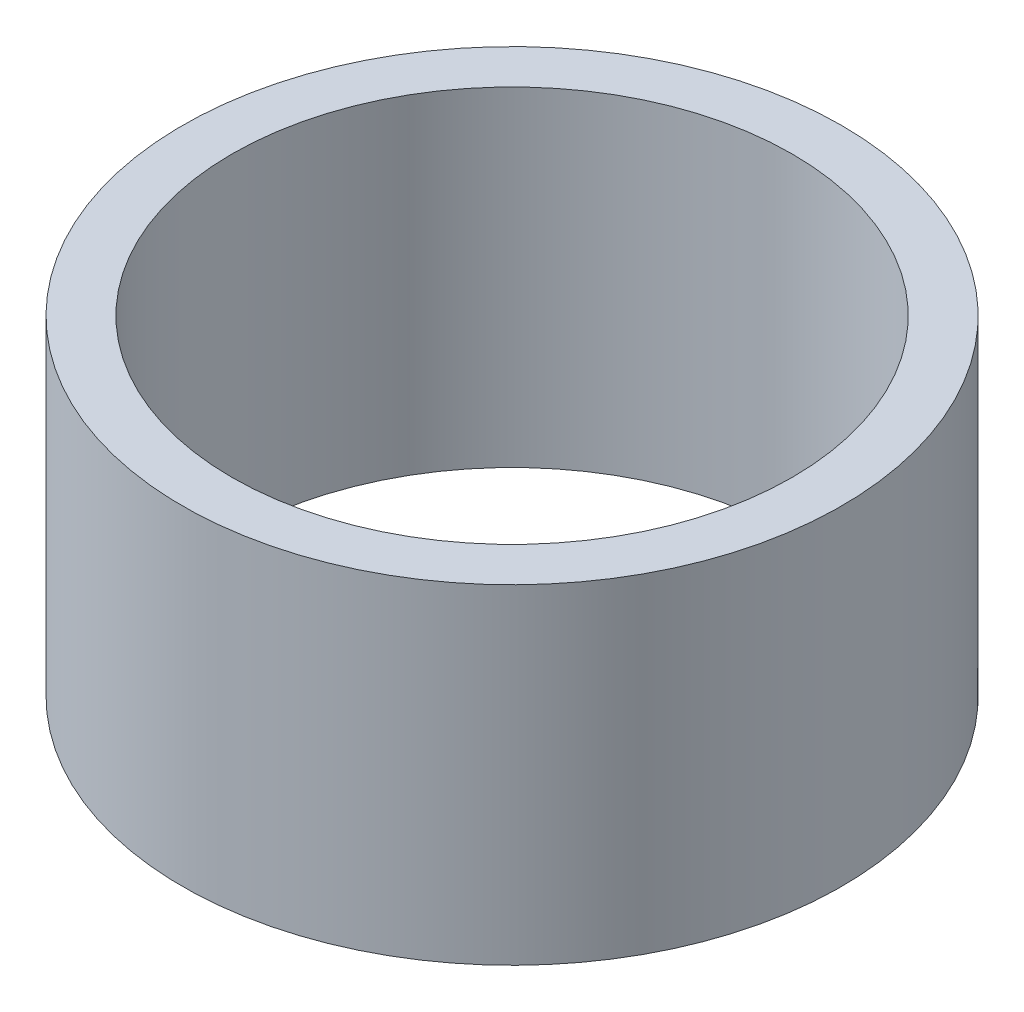
ISO-10303-21;
HEADER;
FILE_DESCRIPTION(('STEP AP214'),'2;1');
FILE_NAME('part.step','',(''),(''),'','','');
FILE_SCHEMA(('AUTOMOTIVE_DESIGN { 1 0 10303 214 1 1 1 1 }'));
ENDSEC;
DATA;
#1=APPLICATION_CONTEXT('core data for automotive mechanical design processes');
#2=APPLICATION_PROTOCOL_DEFINITION('international standard','automotive_design',2000,#1);
#3=PRODUCT_CONTEXT('',#1,'mechanical');
#4=PRODUCT('Part','Part','',(#3));
#5=PRODUCT_RELATED_PRODUCT_CATEGORY('part','',(#4));
#6=PRODUCT_DEFINITION_FORMATION('','',#4);
#7=PRODUCT_DEFINITION_CONTEXT('part definition',#1,'design');
#8=PRODUCT_DEFINITION('design','',#6,#7);
#9=PRODUCT_DEFINITION_SHAPE('','',#8);
#10=(LENGTH_UNIT() NAMED_UNIT(*) SI_UNIT(.MILLI.,.METRE.));
#11=(NAMED_UNIT(*) PLANE_ANGLE_UNIT() SI_UNIT($,.RADIAN.));
#12=(NAMED_UNIT(*) SI_UNIT($,.STERADIAN.) SOLID_ANGLE_UNIT());
#13=UNCERTAINTY_MEASURE_WITH_UNIT(LENGTH_MEASURE(1.E-05),#10,'distance_accuracy_value','');
#14=(GEOMETRIC_REPRESENTATION_CONTEXT(3) GLOBAL_UNCERTAINTY_ASSIGNED_CONTEXT((#13)) GLOBAL_UNIT_ASSIGNED_CONTEXT((#10,
#11,#12)) REPRESENTATION_CONTEXT('',''));
#15=CARTESIAN_POINT('',(0.,0.,0.));
#16=DIRECTION('',(0.,0.,1.));
#17=DIRECTION('',(1.,0.,0.));
#18=AXIS2_PLACEMENT_3D('',#15,#16,#17);
#19=CARTESIAN_POINT('',(0.,25.4,0.));
#20=DIRECTION('',(0.,-1.,0.));
#21=DIRECTION('',(0.,0.,-1.));
#22=AXIS2_PLACEMENT_3D('',#19,#20,#21);
#23=CYLINDRICAL_SURFACE('',#22,43.18);
#24=CARTESIAN_POINT('',(0.,-25.4,0.));
#25=DIRECTION('',(0.,-1.,0.));
#26=DIRECTION('',(0.,0.,-1.));
#27=AXIS2_PLACEMENT_3D('',#24,#25,#26);
#28=CIRCLE('',#27,43.18);
#29=CARTESIAN_POINT('',(0.,-25.4,-43.18));
#30=VERTEX_POINT('',#29);
#31=EDGE_CURVE('E27',#30,#30,#28,.T.);
#32=ORIENTED_EDGE('',*,*,#31,.T.);
#33=EDGE_LOOP('',(#32));
#34=FACE_BOUND('',#33,.T.);
#35=CARTESIAN_POINT('',(0.,25.4,0.));
#36=DIRECTION('',(0.,-1.,0.));
#37=DIRECTION('',(0.,0.,-1.));
#38=AXIS2_PLACEMENT_3D('',#35,#36,#37);
#39=CIRCLE('',#38,43.18);
#40=CARTESIAN_POINT('',(0.,25.4,-43.18));
#41=VERTEX_POINT('',#40);
#42=EDGE_CURVE('E18',#41,#41,#39,.T.);
#43=ORIENTED_EDGE('',*,*,#42,.F.);
#44=EDGE_LOOP('',(#43));
#45=FACE_BOUND('',#44,.T.);
#46=ADVANCED_FACE('F15',(#34,#45),#23,.F.);
#47=CARTESIAN_POINT('',(0.,25.4,0.));
#48=DIRECTION('',(0.,1.,0.));
#49=DIRECTION('',(0.,0.,1.));
#50=AXIS2_PLACEMENT_3D('',#47,#48,#49);
#51=PLANE('',#50);
#52=ORIENTED_EDGE('',*,*,#42,.T.);
#53=EDGE_LOOP('',(#52));
#54=FACE_BOUND('',#53,.T.);
#55=CARTESIAN_POINT('',(0.,25.4,0.));
#56=DIRECTION('',(0.,-1.,0.));
#57=DIRECTION('',(0.,0.,-1.));
#58=AXIS2_PLACEMENT_3D('',#55,#56,#57);
#59=CIRCLE('',#58,50.8);
#60=CARTESIAN_POINT('',(0.,25.4,-50.8));
#61=VERTEX_POINT('',#60);
#62=EDGE_CURVE('E22',#61,#61,#59,.T.);
#63=ORIENTED_EDGE('',*,*,#62,.F.);
#64=EDGE_LOOP('',(#63));
#65=FACE_BOUND('',#64,.T.);
#66=ADVANCED_FACE('F35',(#54,#65),#51,.T.);
#67=CARTESIAN_POINT('',(0.,-25.4,0.));
#68=DIRECTION('',(0.,1.,0.));
#69=DIRECTION('',(0.,0.,1.));
#70=AXIS2_PLACEMENT_3D('',#67,#68,#69);
#71=PLANE('',#70);
#72=ORIENTED_EDGE('',*,*,#31,.F.);
#73=EDGE_LOOP('',(#72));
#74=FACE_BOUND('',#73,.T.);
#75=CARTESIAN_POINT('',(0.,-25.4,0.));
#76=DIRECTION('',(0.,-1.,0.));
#77=DIRECTION('',(0.,0.,-1.));
#78=AXIS2_PLACEMENT_3D('',#75,#76,#77);
#79=CIRCLE('',#78,50.8);
#80=CARTESIAN_POINT('',(0.,-25.4,-50.8));
#81=VERTEX_POINT('',#80);
#82=EDGE_CURVE('E10',#81,#81,#79,.F.);
#83=ORIENTED_EDGE('',*,*,#82,.F.);
#84=EDGE_LOOP('',(#83));
#85=FACE_BOUND('',#84,.T.);
#86=ADVANCED_FACE('F43',(#74,#85),#71,.F.);
#87=CARTESIAN_POINT('',(0.,25.4,0.));
#88=DIRECTION('',(0.,-1.,0.));
#89=DIRECTION('',(0.,0.,-1.));
#90=AXIS2_PLACEMENT_3D('',#87,#88,#89);
#91=CYLINDRICAL_SURFACE('',#90,50.8);
#92=ORIENTED_EDGE('',*,*,#82,.T.);
#93=EDGE_LOOP('',(#92));
#94=FACE_BOUND('',#93,.T.);
#95=ORIENTED_EDGE('',*,*,#62,.T.);
#96=EDGE_LOOP('',(#95));
#97=FACE_BOUND('',#96,.T.);
#98=ADVANCED_FACE('F44',(#94,#97),#91,.T.);
#99=CLOSED_SHELL('',(#46,#66,#86,#98));
#100=MANIFOLD_SOLID_BREP('B1',#99);
#101=ADVANCED_BREP_SHAPE_REPRESENTATION('',(#18,#100),#14);
#102=SHAPE_DEFINITION_REPRESENTATION(#9,#101);
ENDSEC;
END-ISO-10303-21;
